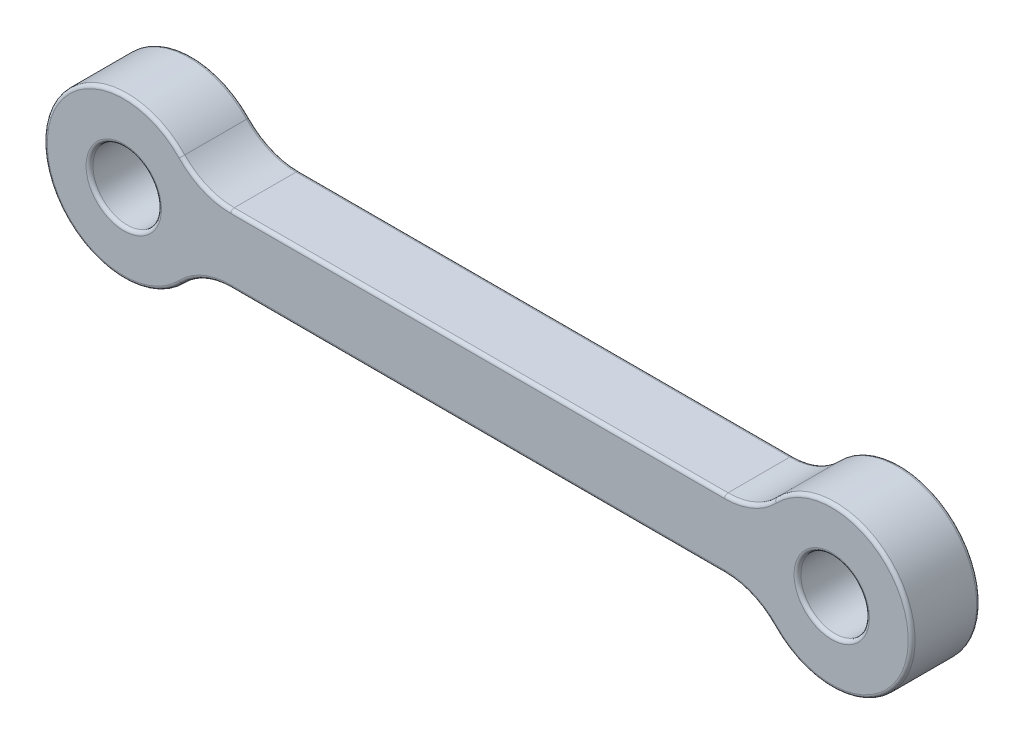
ISO-10303-21;
HEADER;
FILE_DESCRIPTION(('STEP AP214'),'2;1');
FILE_NAME('part.step','',(''),(''),'','','');
FILE_SCHEMA(('AUTOMOTIVE_DESIGN { 1 0 10303 214 1 1 1 1 }'));
ENDSEC;
DATA;
#1=APPLICATION_CONTEXT('core data for automotive mechanical design processes');
#2=APPLICATION_PROTOCOL_DEFINITION('international standard','automotive_design',2000,#1);
#3=PRODUCT_CONTEXT('',#1,'mechanical');
#4=PRODUCT('Part','Part','',(#3));
#5=PRODUCT_RELATED_PRODUCT_CATEGORY('part','',(#4));
#6=PRODUCT_DEFINITION_FORMATION('','',#4);
#7=PRODUCT_DEFINITION_CONTEXT('part definition',#1,'design');
#8=PRODUCT_DEFINITION('design','',#6,#7);
#9=PRODUCT_DEFINITION_SHAPE('','',#8);
#10=(LENGTH_UNIT() NAMED_UNIT(*) SI_UNIT(.MILLI.,.METRE.));
#11=(NAMED_UNIT(*) PLANE_ANGLE_UNIT() SI_UNIT($,.RADIAN.));
#12=(NAMED_UNIT(*) SI_UNIT($,.STERADIAN.) SOLID_ANGLE_UNIT());
#13=UNCERTAINTY_MEASURE_WITH_UNIT(LENGTH_MEASURE(1.E-05),#10,'distance_accuracy_value','');
#14=(GEOMETRIC_REPRESENTATION_CONTEXT(3) GLOBAL_UNCERTAINTY_ASSIGNED_CONTEXT((#13)) GLOBAL_UNIT_ASSIGNED_CONTEXT((#10,
#11,#12)) REPRESENTATION_CONTEXT('',''));
#15=CARTESIAN_POINT('',(0.,0.,0.));
#16=DIRECTION('',(0.,0.,1.));
#17=DIRECTION('',(1.,0.,0.));
#18=AXIS2_PLACEMENT_3D('',#15,#16,#17);
#19=CARTESIAN_POINT('',(0.,0.,3.));
#20=DIRECTION('',(0.,0.,-1.));
#21=DIRECTION('',(-1.,0.,0.));
#22=AXIS2_PLACEMENT_3D('',#19,#20,#21);
#23=CYLINDRICAL_SURFACE('',#22,3.5);
#24=DIRECTION('',(0.,0.,-1.));
#25=VECTOR('',#24,1.);
#26=CARTESIAN_POINT('',(2.52560848605877,2.42307692307692,3.));
#27=LINE('',#26,#25);
#28=CARTESIAN_POINT('',(2.52560848605877,2.42307692307692,2.85));
#29=VERTEX_POINT('',#28);
#30=CARTESIAN_POINT('',(2.52560848605877,2.42307692307692,0.15));
#31=VERTEX_POINT('',#30);
#32=EDGE_CURVE('E299',#29,#31,#27,.T.);
#33=ORIENTED_EDGE('',*,*,#32,.T.);
#34=CARTESIAN_POINT('',(0.,0.,0.15));
#35=DIRECTION('',(0.,0.,1.));
#36=DIRECTION('',(1.,0.,0.));
#37=AXIS2_PLACEMENT_3D('',#34,#35,#36);
#38=CIRCLE('',#37,3.5);
#39=CARTESIAN_POINT('',(2.52560848605877,-2.42307692307692,0.15));
#40=VERTEX_POINT('',#39);
#41=EDGE_CURVE('E214',#31,#40,#38,.T.);
#42=ORIENTED_EDGE('',*,*,#41,.T.);
#43=DIRECTION('',(0.,0.,-1.));
#44=VECTOR('',#43,1.);
#45=CARTESIAN_POINT('',(2.52560848605877,-2.42307692307692,3.));
#46=LINE('',#45,#44);
#47=CARTESIAN_POINT('',(2.52560848605877,-2.42307692307692,2.85));
#48=VERTEX_POINT('',#47);
#49=EDGE_CURVE('E293',#40,#48,#46,.F.);
#50=ORIENTED_EDGE('',*,*,#49,.T.);
#51=CARTESIAN_POINT('',(0.,0.,2.85));
#52=DIRECTION('',(0.,0.,1.));
#53=DIRECTION('',(1.,0.,0.));
#54=AXIS2_PLACEMENT_3D('',#51,#52,#53);
#55=CIRCLE('',#54,3.5);
#56=EDGE_CURVE('E212',#48,#29,#55,.F.);
#57=ORIENTED_EDGE('',*,*,#56,.T.);
#58=EDGE_LOOP('',(#33,#42,#50,#57));
#59=FACE_BOUND('',#58,.T.);
#60=ADVANCED_FACE('F34',(#59),#23,.T.);
#61=CARTESIAN_POINT('',(0.,-1.5,3.));
#62=DIRECTION('',(0.,-1.,0.));
#63=DIRECTION('',(0.,0.,-1.));
#64=AXIS2_PLACEMENT_3D('',#61,#62,#63);
#65=PLANE('',#64);
#66=DIRECTION('',(0.,0.,-1.));
#67=VECTOR('',#66,1.);
#68=CARTESIAN_POINT('',(4.69041575982343,-1.5,3.));
#69=LINE('',#68,#67);
#70=CARTESIAN_POINT('',(4.69041575982343,-1.5,2.85));
#71=VERTEX_POINT('',#70);
#72=CARTESIAN_POINT('',(4.69041575982343,-1.5,0.15));
#73=VERTEX_POINT('',#72);
#74=EDGE_CURVE('E295',#71,#73,#69,.T.);
#75=ORIENTED_EDGE('',*,*,#74,.T.);
#76=DIRECTION('',(-1.,0.,0.));
#77=VECTOR('',#76,1.);
#78=CARTESIAN_POINT('',(26.3095842401766,-1.5,0.15));
#79=LINE('',#78,#77);
#80=CARTESIAN_POINT('',(26.3095842401766,-1.5,0.15));
#81=VERTEX_POINT('',#80);
#82=EDGE_CURVE('E189',#73,#81,#79,.F.);
#83=ORIENTED_EDGE('',*,*,#82,.T.);
#84=DIRECTION('',(0.,0.,1.));
#85=VECTOR('',#84,1.);
#86=CARTESIAN_POINT('',(26.3095842401766,-1.5,3.));
#87=LINE('',#86,#85);
#88=CARTESIAN_POINT('',(26.3095842401766,-1.5,2.85));
#89=VERTEX_POINT('',#88);
#90=EDGE_CURVE('E309',#81,#89,#87,.T.);
#91=ORIENTED_EDGE('',*,*,#90,.T.);
#92=DIRECTION('',(-1.,0.,0.));
#93=VECTOR('',#92,1.);
#94=CARTESIAN_POINT('',(0.,-1.5,2.85));
#95=LINE('',#94,#93);
#96=EDGE_CURVE('E187',#89,#71,#95,.T.);
#97=ORIENTED_EDGE('',*,*,#96,.T.);
#98=EDGE_LOOP('',(#75,#83,#91,#97));
#99=FACE_BOUND('',#98,.T.);
#100=ADVANCED_FACE('F338',(#99),#65,.T.);
#101=CARTESIAN_POINT('',(31.,0.,3.));
#102=DIRECTION('',(0.,0.,-1.));
#103=DIRECTION('',(-1.,0.,0.));
#104=AXIS2_PLACEMENT_3D('',#101,#102,#103);
#105=CYLINDRICAL_SURFACE('',#104,3.5);
#106=DIRECTION('',(0.,0.,-1.));
#107=VECTOR('',#106,1.);
#108=CARTESIAN_POINT('',(28.4743915139412,-2.42307692307692,3.));
#109=LINE('',#108,#107);
#110=CARTESIAN_POINT('',(28.4743915139412,-2.42307692307692,2.85));
#111=VERTEX_POINT('',#110);
#112=CARTESIAN_POINT('',(28.4743915139412,-2.42307692307692,0.15));
#113=VERTEX_POINT('',#112);
#114=EDGE_CURVE('E304',#111,#113,#109,.T.);
#115=ORIENTED_EDGE('',*,*,#114,.T.);
#116=CARTESIAN_POINT('',(31.,0.,0.15));
#117=DIRECTION('',(0.,0.,1.));
#118=DIRECTION('',(1.,0.,0.));
#119=AXIS2_PLACEMENT_3D('',#116,#117,#118);
#120=CIRCLE('',#119,3.5);
#121=CARTESIAN_POINT('',(28.4743915139412,2.42307692307692,0.15));
#122=VERTEX_POINT('',#121);
#123=EDGE_CURVE('E197',#113,#122,#120,.T.);
#124=ORIENTED_EDGE('',*,*,#123,.T.);
#125=DIRECTION('',(0.,0.,-1.));
#126=VECTOR('',#125,1.);
#127=CARTESIAN_POINT('',(28.4743915139412,2.42307692307692,3.));
#128=LINE('',#127,#126);
#129=CARTESIAN_POINT('',(28.4743915139412,2.42307692307692,2.85));
#130=VERTEX_POINT('',#129);
#131=EDGE_CURVE('E300',#122,#130,#128,.F.);
#132=ORIENTED_EDGE('',*,*,#131,.T.);
#133=CARTESIAN_POINT('',(31.,0.,2.85));
#134=DIRECTION('',(0.,0.,1.));
#135=DIRECTION('',(1.,0.,0.));
#136=AXIS2_PLACEMENT_3D('',#133,#134,#135);
#137=CIRCLE('',#136,3.5);
#138=EDGE_CURVE('E195',#130,#111,#137,.F.);
#139=ORIENTED_EDGE('',*,*,#138,.T.);
#140=EDGE_LOOP('',(#115,#124,#132,#139));
#141=FACE_BOUND('',#140,.T.);
#142=ADVANCED_FACE('F382',(#141),#105,.T.);
#143=CARTESIAN_POINT('',(0.,1.5,3.));
#144=DIRECTION('',(0.,-1.,0.));
#145=DIRECTION('',(0.,0.,-1.));
#146=AXIS2_PLACEMENT_3D('',#143,#144,#145);
#147=PLANE('',#146);
#148=DIRECTION('',(0.,0.,-1.));
#149=VECTOR('',#148,1.);
#150=CARTESIAN_POINT('',(26.3095842401766,1.5,3.));
#151=LINE('',#150,#149);
#152=CARTESIAN_POINT('',(26.3095842401766,1.5,2.85));
#153=VERTEX_POINT('',#152);
#154=CARTESIAN_POINT('',(26.3095842401766,1.5,0.15));
#155=VERTEX_POINT('',#154);
#156=EDGE_CURVE('E371',#153,#155,#151,.T.);
#157=ORIENTED_EDGE('',*,*,#156,.T.);
#158=DIRECTION('',(-1.,0.,0.));
#159=VECTOR('',#158,1.);
#160=CARTESIAN_POINT('',(0.,1.5,0.15));
#161=LINE('',#160,#159);
#162=CARTESIAN_POINT('',(4.69041575982343,1.5,0.15));
#163=VERTEX_POINT('',#162);
#164=EDGE_CURVE('E206',#155,#163,#161,.T.);
#165=ORIENTED_EDGE('',*,*,#164,.T.);
#166=DIRECTION('',(0.,0.,1.));
#167=VECTOR('',#166,1.);
#168=CARTESIAN_POINT('',(4.69041575982343,1.5,3.));
#169=LINE('',#168,#167);
#170=CARTESIAN_POINT('',(4.69041575982343,1.5,2.85));
#171=VERTEX_POINT('',#170);
#172=EDGE_CURVE('E255',#163,#171,#169,.T.);
#173=ORIENTED_EDGE('',*,*,#172,.T.);
#174=DIRECTION('',(-1.,0.,0.));
#175=VECTOR('',#174,1.);
#176=CARTESIAN_POINT('',(26.3095842401766,1.5,2.85));
#177=LINE('',#176,#175);
#178=EDGE_CURVE('E204',#171,#153,#177,.F.);
#179=ORIENTED_EDGE('',*,*,#178,.T.);
#180=EDGE_LOOP('',(#157,#165,#173,#179));
#181=FACE_BOUND('',#180,.T.);
#182=ADVANCED_FACE('F370',(#181),#147,.F.);
#183=CARTESIAN_POINT('',(0.,0.,3.));
#184=DIRECTION('',(0.,0.,-1.));
#185=DIRECTION('',(-1.,0.,0.));
#186=AXIS2_PLACEMENT_3D('',#183,#184,#185);
#187=CYLINDRICAL_SURFACE('',#186,1.5);
#188=CARTESIAN_POINT('',(0.,0.,0.15));
#189=DIRECTION('',(0.,0.,1.));
#190=DIRECTION('',(1.,0.,0.));
#191=AXIS2_PLACEMENT_3D('',#188,#189,#190);
#192=CIRCLE('',#191,1.5);
#193=CARTESIAN_POINT('',(1.5,0.,0.15));
#194=VERTEX_POINT('',#193);
#195=EDGE_CURVE('E219',#194,#194,#192,.F.);
#196=ORIENTED_EDGE('',*,*,#195,.T.);
#197=EDGE_LOOP('',(#196));
#198=FACE_BOUND('',#197,.T.);
#199=CARTESIAN_POINT('',(0.,0.,2.85));
#200=DIRECTION('',(0.,0.,1.));
#201=DIRECTION('',(1.,0.,0.));
#202=AXIS2_PLACEMENT_3D('',#199,#200,#201);
#203=CIRCLE('',#202,1.5);
#204=CARTESIAN_POINT('',(1.5,0.,2.85));
#205=VERTEX_POINT('',#204);
#206=EDGE_CURVE('E216',#205,#205,#203,.T.);
#207=ORIENTED_EDGE('',*,*,#206,.T.);
#208=EDGE_LOOP('',(#207));
#209=FACE_BOUND('',#208,.T.);
#210=ADVANCED_FACE('F414',(#198,#209),#187,.F.);
#211=CARTESIAN_POINT('',(31.,0.,3.));
#212=DIRECTION('',(0.,0.,-1.));
#213=DIRECTION('',(-1.,0.,0.));
#214=AXIS2_PLACEMENT_3D('',#211,#212,#213);
#215=CYLINDRICAL_SURFACE('',#214,1.5);
#216=CARTESIAN_POINT('',(31.,0.,0.15));
#217=DIRECTION('',(0.,0.,1.));
#218=DIRECTION('',(1.,0.,0.));
#219=AXIS2_PLACEMENT_3D('',#216,#217,#218);
#220=CIRCLE('',#219,1.5);
#221=CARTESIAN_POINT('',(32.5,0.,0.15));
#222=VERTEX_POINT('',#221);
#223=EDGE_CURVE('E315',#222,#222,#220,.F.);
#224=ORIENTED_EDGE('',*,*,#223,.T.);
#225=EDGE_LOOP('',(#224));
#226=FACE_BOUND('',#225,.T.);
#227=CARTESIAN_POINT('',(31.,0.,2.85));
#228=DIRECTION('',(0.,0.,1.));
#229=DIRECTION('',(1.,0.,0.));
#230=AXIS2_PLACEMENT_3D('',#227,#228,#229);
#231=CIRCLE('',#230,1.5);
#232=CARTESIAN_POINT('',(32.5,0.,2.85));
#233=VERTEX_POINT('',#232);
#234=EDGE_CURVE('E312',#233,#233,#231,.T.);
#235=ORIENTED_EDGE('',*,*,#234,.T.);
#236=EDGE_LOOP('',(#235));
#237=FACE_BOUND('',#236,.T.);
#238=ADVANCED_FACE('F417',(#226,#237),#215,.F.);
#239=CARTESIAN_POINT('',(0.,0.,3.));
#240=DIRECTION('',(0.,0.,1.));
#241=DIRECTION('',(1.,0.,0.));
#242=AXIS2_PLACEMENT_3D('',#239,#240,#241);
#243=PLANE('',#242);
#244=CARTESIAN_POINT('',(31.,0.,3.));
#245=DIRECTION('',(0.,0.,1.));
#246=DIRECTION('',(1.,0.,0.));
#247=AXIS2_PLACEMENT_3D('',#244,#245,#246);
#248=CIRCLE('',#247,1.65);
#249=CARTESIAN_POINT('',(32.65,0.,3.));
#250=VERTEX_POINT('',#249);
#251=EDGE_CURVE('E11',#250,#250,#248,.F.);
#252=ORIENTED_EDGE('',*,*,#251,.T.);
#253=EDGE_LOOP('',(#252));
#254=FACE_BOUND('',#253,.T.);
#255=CARTESIAN_POINT('',(31.,0.,3.));
#256=DIRECTION('',(0.,0.,1.));
#257=DIRECTION('',(1.,0.,0.));
#258=AXIS2_PLACEMENT_3D('',#255,#256,#257);
#259=CIRCLE('',#258,3.35);
#260=CARTESIAN_POINT('',(28.5826318776295,-2.31923076923077,3.));
#261=VERTEX_POINT('',#260);
#262=CARTESIAN_POINT('',(28.5826318776295,2.31923076923077,3.));
#263=VERTEX_POINT('',#262);
#264=EDGE_CURVE('E51',#261,#263,#259,.T.);
#265=ORIENTED_EDGE('',*,*,#264,.T.);
#266=CARTESIAN_POINT('',(26.3095842401766,4.5,3.));
#267=DIRECTION('',(0.,0.,1.));
#268=DIRECTION('',(1.,0.,0.));
#269=AXIS2_PLACEMENT_3D('',#266,#267,#268);
#270=CIRCLE('',#269,3.15);
#271=CARTESIAN_POINT('',(26.3095842401766,1.35,3.));
#272=VERTEX_POINT('',#271);
#273=EDGE_CURVE('E43',#263,#272,#270,.F.);
#274=ORIENTED_EDGE('',*,*,#273,.T.);
#275=DIRECTION('',(-1.,0.,0.));
#276=VECTOR('',#275,1.);
#277=CARTESIAN_POINT('',(4.69041575982343,1.35,3.));
#278=LINE('',#277,#276);
#279=CARTESIAN_POINT('',(4.69041575982343,1.35,3.));
#280=VERTEX_POINT('',#279);
#281=EDGE_CURVE('E225',#272,#280,#278,.T.);
#282=ORIENTED_EDGE('',*,*,#281,.T.);
#283=CARTESIAN_POINT('',(4.69041575982343,4.5,3.));
#284=DIRECTION('',(0.,0.,1.));
#285=DIRECTION('',(1.,0.,0.));
#286=AXIS2_PLACEMENT_3D('',#283,#284,#285);
#287=CIRCLE('',#286,3.15);
#288=CARTESIAN_POINT('',(2.41736812237054,2.31923076923077,3.));
#289=VERTEX_POINT('',#288);
#290=EDGE_CURVE('E227',#280,#289,#287,.F.);
#291=ORIENTED_EDGE('',*,*,#290,.T.);
#292=CARTESIAN_POINT('',(0.,0.,3.));
#293=DIRECTION('',(0.,0.,1.));
#294=DIRECTION('',(1.,0.,0.));
#295=AXIS2_PLACEMENT_3D('',#292,#293,#294);
#296=CIRCLE('',#295,3.35);
#297=CARTESIAN_POINT('',(2.41736812237054,-2.31923076923077,3.));
#298=VERTEX_POINT('',#297);
#299=EDGE_CURVE('E229',#289,#298,#296,.T.);
#300=ORIENTED_EDGE('',*,*,#299,.T.);
#301=CARTESIAN_POINT('',(4.69041575982343,-4.5,3.));
#302=DIRECTION('',(0.,0.,1.));
#303=DIRECTION('',(1.,0.,0.));
#304=AXIS2_PLACEMENT_3D('',#301,#302,#303);
#305=CIRCLE('',#304,3.15);
#306=CARTESIAN_POINT('',(4.69041575982343,-1.35,3.));
#307=VERTEX_POINT('',#306);
#308=EDGE_CURVE('E231',#298,#307,#305,.F.);
#309=ORIENTED_EDGE('',*,*,#308,.T.);
#310=DIRECTION('',(-1.,0.,0.));
#311=VECTOR('',#310,1.);
#312=CARTESIAN_POINT('',(0.,-1.35,3.));
#313=LINE('',#312,#311);
#314=CARTESIAN_POINT('',(26.3095842401766,-1.35,3.));
#315=VERTEX_POINT('',#314);
#316=EDGE_CURVE('E233',#307,#315,#313,.F.);
#317=ORIENTED_EDGE('',*,*,#316,.T.);
#318=CARTESIAN_POINT('',(26.3095842401766,-4.5,3.));
#319=DIRECTION('',(0.,0.,1.));
#320=DIRECTION('',(1.,0.,0.));
#321=AXIS2_PLACEMENT_3D('',#318,#319,#320);
#322=CIRCLE('',#321,3.15);
#323=EDGE_CURVE('E56',#315,#261,#322,.F.);
#324=ORIENTED_EDGE('',*,*,#323,.T.);
#325=EDGE_LOOP('',(#265,#274,#282,#291,#300,#309,#317,#324));
#326=FACE_BOUND('',#325,.T.);
#327=CARTESIAN_POINT('',(0.,0.,3.));
#328=DIRECTION('',(0.,0.,1.));
#329=DIRECTION('',(1.,0.,0.));
#330=AXIS2_PLACEMENT_3D('',#327,#328,#329);
#331=CIRCLE('',#330,1.65);
#332=CARTESIAN_POINT('',(1.65,0.,3.));
#333=VERTEX_POINT('',#332);
#334=EDGE_CURVE('E222',#333,#333,#331,.F.);
#335=ORIENTED_EDGE('',*,*,#334,.T.);
#336=EDGE_LOOP('',(#335));
#337=FACE_BOUND('',#336,.T.);
#338=ADVANCED_FACE('F355',(#254,#326,#337),#243,.T.);
#339=CARTESIAN_POINT('',(0.,0.,0.));
#340=DIRECTION('',(0.,0.,1.));
#341=DIRECTION('',(1.,0.,0.));
#342=AXIS2_PLACEMENT_3D('',#339,#340,#341);
#343=PLANE('',#342);
#344=CARTESIAN_POINT('',(31.,0.,0.));
#345=DIRECTION('',(0.,0.,1.));
#346=DIRECTION('',(1.,0.,0.));
#347=AXIS2_PLACEMENT_3D('',#344,#345,#346);
#348=CIRCLE('',#347,1.65);
#349=CARTESIAN_POINT('',(32.65,0.,0.));
#350=VERTEX_POINT('',#349);
#351=EDGE_CURVE('E176',#350,#350,#348,.T.);
#352=ORIENTED_EDGE('',*,*,#351,.T.);
#353=EDGE_LOOP('',(#352));
#354=FACE_BOUND('',#353,.T.);
#355=DIRECTION('',(-1.,0.,0.));
#356=VECTOR('',#355,1.);
#357=CARTESIAN_POINT('',(4.69041575982343,-1.35,0.));
#358=LINE('',#357,#356);
#359=CARTESIAN_POINT('',(26.3095842401766,-1.35,0.));
#360=VERTEX_POINT('',#359);
#361=CARTESIAN_POINT('',(4.69041575982343,-1.35,0.));
#362=VERTEX_POINT('',#361);
#363=EDGE_CURVE('E174',#360,#362,#358,.T.);
#364=ORIENTED_EDGE('',*,*,#363,.T.);
#365=CARTESIAN_POINT('',(4.69041575982343,-4.5,0.));
#366=DIRECTION('',(0.,0.,1.));
#367=DIRECTION('',(1.,0.,0.));
#368=AXIS2_PLACEMENT_3D('',#365,#366,#367);
#369=CIRCLE('',#368,3.15);
#370=CARTESIAN_POINT('',(2.41736812237054,-2.31923076923077,0.));
#371=VERTEX_POINT('',#370);
#372=EDGE_CURVE('E154',#362,#371,#369,.T.);
#373=ORIENTED_EDGE('',*,*,#372,.T.);
#374=CARTESIAN_POINT('',(0.,0.,0.));
#375=DIRECTION('',(0.,0.,1.));
#376=DIRECTION('',(1.,0.,0.));
#377=AXIS2_PLACEMENT_3D('',#374,#375,#376);
#378=CIRCLE('',#377,3.35);
#379=CARTESIAN_POINT('',(2.41736812237054,2.31923076923077,0.));
#380=VERTEX_POINT('',#379);
#381=EDGE_CURVE('E162',#371,#380,#378,.F.);
#382=ORIENTED_EDGE('',*,*,#381,.T.);
#383=CARTESIAN_POINT('',(4.69041575982343,4.5,0.));
#384=DIRECTION('',(0.,0.,1.));
#385=DIRECTION('',(1.,0.,0.));
#386=AXIS2_PLACEMENT_3D('',#383,#384,#385);
#387=CIRCLE('',#386,3.15);
#388=CARTESIAN_POINT('',(4.69041575982343,1.35,0.));
#389=VERTEX_POINT('',#388);
#390=EDGE_CURVE('E168',#380,#389,#387,.T.);
#391=ORIENTED_EDGE('',*,*,#390,.T.);
#392=DIRECTION('',(-1.,0.,0.));
#393=VECTOR('',#392,1.);
#394=CARTESIAN_POINT('',(0.,1.35,0.));
#395=LINE('',#394,#393);
#396=CARTESIAN_POINT('',(26.3095842401766,1.35,0.));
#397=VERTEX_POINT('',#396);
#398=EDGE_CURVE('E321',#389,#397,#395,.F.);
#399=ORIENTED_EDGE('',*,*,#398,.T.);
#400=CARTESIAN_POINT('',(26.3095842401766,4.5,0.));
#401=DIRECTION('',(0.,0.,1.));
#402=DIRECTION('',(1.,0.,0.));
#403=AXIS2_PLACEMENT_3D('',#400,#401,#402);
#404=CIRCLE('',#403,3.15);
#405=CARTESIAN_POINT('',(28.5826318776295,2.31923076923077,0.));
#406=VERTEX_POINT('',#405);
#407=EDGE_CURVE('E323',#397,#406,#404,.T.);
#408=ORIENTED_EDGE('',*,*,#407,.T.);
#409=CARTESIAN_POINT('',(31.,0.,0.));
#410=DIRECTION('',(0.,0.,1.));
#411=DIRECTION('',(1.,0.,0.));
#412=AXIS2_PLACEMENT_3D('',#409,#410,#411);
#413=CIRCLE('',#412,3.35);
#414=CARTESIAN_POINT('',(28.5826318776295,-2.31923076923077,0.));
#415=VERTEX_POINT('',#414);
#416=EDGE_CURVE('E325',#406,#415,#413,.F.);
#417=ORIENTED_EDGE('',*,*,#416,.T.);
#418=CARTESIAN_POINT('',(26.3095842401766,-4.5,0.));
#419=DIRECTION('',(0.,0.,1.));
#420=DIRECTION('',(1.,0.,0.));
#421=AXIS2_PLACEMENT_3D('',#418,#419,#420);
#422=CIRCLE('',#421,3.15);
#423=EDGE_CURVE('E181',#415,#360,#422,.T.);
#424=ORIENTED_EDGE('',*,*,#423,.T.);
#425=EDGE_LOOP('',(#364,#373,#382,#391,#399,#408,#417,#424));
#426=FACE_BOUND('',#425,.T.);
#427=CARTESIAN_POINT('',(0.,0.,0.));
#428=DIRECTION('',(0.,0.,1.));
#429=DIRECTION('',(1.,0.,0.));
#430=AXIS2_PLACEMENT_3D('',#427,#428,#429);
#431=CIRCLE('',#430,1.65);
#432=CARTESIAN_POINT('',(1.65,0.,0.));
#433=VERTEX_POINT('',#432);
#434=EDGE_CURVE('E169',#433,#433,#431,.T.);
#435=ORIENTED_EDGE('',*,*,#434,.T.);
#436=EDGE_LOOP('',(#435));
#437=FACE_BOUND('',#436,.T.);
#438=ADVANCED_FACE('F171',(#354,#426,#437),#343,.F.);
#439=CARTESIAN_POINT('',(26.3095842401766,4.5,3.));
#440=DIRECTION('',(0.,0.,-1.));
#441=DIRECTION('',(-1.,0.,0.));
#442=AXIS2_PLACEMENT_3D('',#439,#440,#441);
#443=CYLINDRICAL_SURFACE('',#442,3.);
#444=ORIENTED_EDGE('',*,*,#131,.F.);
#445=CARTESIAN_POINT('',(26.3095842401766,4.5,0.15));
#446=DIRECTION('',(0.,0.,1.));
#447=DIRECTION('',(1.,0.,0.));
#448=AXIS2_PLACEMENT_3D('',#445,#446,#447);
#449=CIRCLE('',#448,3.);
#450=EDGE_CURVE('E202',#122,#155,#449,.F.);
#451=ORIENTED_EDGE('',*,*,#450,.T.);
#452=ORIENTED_EDGE('',*,*,#156,.F.);
#453=CARTESIAN_POINT('',(26.3095842401766,4.5,2.85));
#454=DIRECTION('',(0.,0.,1.));
#455=DIRECTION('',(1.,0.,0.));
#456=AXIS2_PLACEMENT_3D('',#453,#454,#455);
#457=CIRCLE('',#456,3.);
#458=EDGE_CURVE('E199',#153,#130,#457,.T.);
#459=ORIENTED_EDGE('',*,*,#458,.T.);
#460=EDGE_LOOP('',(#444,#451,#452,#459));
#461=FACE_BOUND('',#460,.T.);
#462=ADVANCED_FACE('F376',(#461),#443,.F.);
#463=CARTESIAN_POINT('',(4.69041575982343,4.5,3.));
#464=DIRECTION('',(0.,0.,-1.));
#465=DIRECTION('',(-1.,0.,0.));
#466=AXIS2_PLACEMENT_3D('',#463,#464,#465);
#467=CYLINDRICAL_SURFACE('',#466,3.);
#468=ORIENTED_EDGE('',*,*,#172,.F.);
#469=CARTESIAN_POINT('',(4.69041575982343,4.5,0.15));
#470=DIRECTION('',(0.,0.,1.));
#471=DIRECTION('',(1.,0.,0.));
#472=AXIS2_PLACEMENT_3D('',#469,#470,#471);
#473=CIRCLE('',#472,3.);
#474=EDGE_CURVE('E210',#163,#31,#473,.F.);
#475=ORIENTED_EDGE('',*,*,#474,.T.);
#476=ORIENTED_EDGE('',*,*,#32,.F.);
#477=CARTESIAN_POINT('',(4.69041575982343,4.5,2.85));
#478=DIRECTION('',(0.,0.,1.));
#479=DIRECTION('',(1.,0.,0.));
#480=AXIS2_PLACEMENT_3D('',#477,#478,#479);
#481=CIRCLE('',#480,3.);
#482=EDGE_CURVE('E208',#29,#171,#481,.T.);
#483=ORIENTED_EDGE('',*,*,#482,.T.);
#484=EDGE_LOOP('',(#468,#475,#476,#483));
#485=FACE_BOUND('',#484,.T.);
#486=ADVANCED_FACE('F396',(#485),#467,.F.);
#487=CARTESIAN_POINT('',(26.3095842401766,-4.5,3.));
#488=DIRECTION('',(0.,0.,-1.));
#489=DIRECTION('',(-1.,0.,0.));
#490=AXIS2_PLACEMENT_3D('',#487,#488,#489);
#491=CYLINDRICAL_SURFACE('',#490,3.);
#492=ORIENTED_EDGE('',*,*,#90,.F.);
#493=CARTESIAN_POINT('',(26.3095842401766,-4.5,0.15));
#494=DIRECTION('',(0.,0.,1.));
#495=DIRECTION('',(1.,0.,0.));
#496=AXIS2_PLACEMENT_3D('',#493,#494,#495);
#497=CIRCLE('',#496,3.);
#498=EDGE_CURVE('E193',#81,#113,#497,.F.);
#499=ORIENTED_EDGE('',*,*,#498,.T.);
#500=ORIENTED_EDGE('',*,*,#114,.F.);
#501=CARTESIAN_POINT('',(26.3095842401766,-4.5,2.85));
#502=DIRECTION('',(0.,0.,1.));
#503=DIRECTION('',(1.,0.,0.));
#504=AXIS2_PLACEMENT_3D('',#501,#502,#503);
#505=CIRCLE('',#504,3.);
#506=EDGE_CURVE('E191',#111,#89,#505,.T.);
#507=ORIENTED_EDGE('',*,*,#506,.T.);
#508=EDGE_LOOP('',(#492,#499,#500,#507));
#509=FACE_BOUND('',#508,.T.);
#510=ADVANCED_FACE('F340',(#509),#491,.F.);
#511=CARTESIAN_POINT('',(4.69041575982343,-4.5,3.));
#512=DIRECTION('',(0.,0.,-1.));
#513=DIRECTION('',(-1.,0.,0.));
#514=AXIS2_PLACEMENT_3D('',#511,#512,#513);
#515=CYLINDRICAL_SURFACE('',#514,3.);
#516=ORIENTED_EDGE('',*,*,#49,.F.);
#517=CARTESIAN_POINT('',(4.69041575982343,-4.5,0.15));
#518=DIRECTION('',(0.,0.,1.));
#519=DIRECTION('',(1.,0.,0.));
#520=AXIS2_PLACEMENT_3D('',#517,#518,#519);
#521=CIRCLE('',#520,3.);
#522=EDGE_CURVE('E156',#40,#73,#521,.F.);
#523=ORIENTED_EDGE('',*,*,#522,.T.);
#524=ORIENTED_EDGE('',*,*,#74,.F.);
#525=CARTESIAN_POINT('',(4.69041575982343,-4.5,2.85));
#526=DIRECTION('',(0.,0.,1.));
#527=DIRECTION('',(1.,0.,0.));
#528=AXIS2_PLACEMENT_3D('',#525,#526,#527);
#529=CIRCLE('',#528,3.);
#530=EDGE_CURVE('E179',#71,#48,#529,.T.);
#531=ORIENTED_EDGE('',*,*,#530,.T.);
#532=EDGE_LOOP('',(#516,#523,#524,#531));
#533=FACE_BOUND('',#532,.T.);
#534=ADVANCED_FACE('F292',(#533),#515,.F.);
#535=CARTESIAN_POINT('',(31.,0.,0.15));
#536=DIRECTION('',(0.,0.,1.));
#537=DIRECTION('',(1.,0.,0.));
#538=AXIS2_PLACEMENT_3D('',#535,#536,#537);
#539=TOROIDAL_SURFACE('',#538,1.65,0.15);
#540=ORIENTED_EDGE('',*,*,#351,.F.);
#541=EDGE_LOOP('',(#540));
#542=FACE_BOUND('',#541,.T.);
#543=ORIENTED_EDGE('',*,*,#223,.F.);
#544=EDGE_LOOP('',(#543));
#545=FACE_BOUND('',#544,.T.);
#546=ADVANCED_FACE('F427',(#542,#545),#539,.T.);
#547=CARTESIAN_POINT('',(26.3095842401766,4.5,0.15));
#548=DIRECTION('',(0.,0.,1.));
#549=DIRECTION('',(1.,0.,0.));
#550=AXIS2_PLACEMENT_3D('',#547,#548,#549);
#551=TOROIDAL_SURFACE('',#550,3.15,0.15);
#552=CARTESIAN_POINT('',(26.3095842401766,1.35,0.15));
#553=DIRECTION('',(-1.,0.,0.));
#554=DIRECTION('',(0.,0.,1.));
#555=AXIS2_PLACEMENT_3D('',#552,#553,#554);
#556=CIRCLE('',#555,0.15);
#557=EDGE_CURVE('E249',#155,#397,#556,.T.);
#558=ORIENTED_EDGE('',*,*,#557,.F.);
#559=ORIENTED_EDGE('',*,*,#450,.F.);
#560=CARTESIAN_POINT('',(28.5826318776295,2.31923076923077,0.15));
#561=DIRECTION('',(0.6923076923077,0.721602424588213,0.));
#562=DIRECTION('',(-0.721602424588213,0.6923076923077,0.));
#563=AXIS2_PLACEMENT_3D('',#560,#561,#562);
#564=CIRCLE('',#563,0.15);
#565=EDGE_CURVE('E252',#406,#122,#564,.T.);
#566=ORIENTED_EDGE('',*,*,#565,.F.);
#567=ORIENTED_EDGE('',*,*,#407,.F.);
#568=EDGE_LOOP('',(#558,#559,#566,#567));
#569=FACE_BOUND('',#568,.T.);
#570=ADVANCED_FACE('F388',(#569),#551,.T.);
#571=CARTESIAN_POINT('',(31.,0.,0.15));
#572=DIRECTION('',(0.,0.,1.));
#573=DIRECTION('',(1.,0.,0.));
#574=AXIS2_PLACEMENT_3D('',#571,#572,#573);
#575=TOROIDAL_SURFACE('',#574,3.35,0.15);
#576=ORIENTED_EDGE('',*,*,#565,.T.);
#577=ORIENTED_EDGE('',*,*,#123,.F.);
#578=CARTESIAN_POINT('',(28.5826318776295,-2.31923076923077,0.15));
#579=DIRECTION('',(-0.692307692307698,0.721602424588214,0.));
#580=DIRECTION('',(-0.721602424588214,-0.692307692307698,0.));
#581=AXIS2_PLACEMENT_3D('',#578,#579,#580);
#582=CIRCLE('',#581,0.15);
#583=EDGE_CURVE('E246',#415,#113,#582,.T.);
#584=ORIENTED_EDGE('',*,*,#583,.F.);
#585=ORIENTED_EDGE('',*,*,#416,.F.);
#586=EDGE_LOOP('',(#576,#577,#584,#585));
#587=FACE_BOUND('',#586,.T.);
#588=ADVANCED_FACE('F384',(#587),#575,.T.);
#589=CARTESIAN_POINT('',(0.,1.35,0.15));
#590=DIRECTION('',(-1.,0.,0.));
#591=DIRECTION('',(0.,0.,1.));
#592=AXIS2_PLACEMENT_3D('',#589,#590,#591);
#593=CYLINDRICAL_SURFACE('',#592,0.15);
#594=ORIENTED_EDGE('',*,*,#557,.T.);
#595=ORIENTED_EDGE('',*,*,#398,.F.);
#596=CARTESIAN_POINT('',(4.69041575982343,1.35,0.15));
#597=DIRECTION('',(-1.,0.,0.));
#598=DIRECTION('',(0.,0.,1.));
#599=AXIS2_PLACEMENT_3D('',#596,#597,#598);
#600=CIRCLE('',#599,0.15);
#601=EDGE_CURVE('E243',#163,#389,#600,.T.);
#602=ORIENTED_EDGE('',*,*,#601,.F.);
#603=ORIENTED_EDGE('',*,*,#164,.F.);
#604=EDGE_LOOP('',(#594,#595,#602,#603));
#605=FACE_BOUND('',#604,.T.);
#606=ADVANCED_FACE('F393',(#605),#593,.T.);
#607=CARTESIAN_POINT('',(26.3095842401766,-4.5,0.15));
#608=DIRECTION('',(0.,0.,1.));
#609=DIRECTION('',(1.,0.,0.));
#610=AXIS2_PLACEMENT_3D('',#607,#608,#609);
#611=TOROIDAL_SURFACE('',#610,3.15,0.15);
#612=ORIENTED_EDGE('',*,*,#583,.T.);
#613=ORIENTED_EDGE('',*,*,#498,.F.);
#614=CARTESIAN_POINT('',(26.3095842401766,-1.35,0.15));
#615=DIRECTION('',(-1.,0.,0.));
#616=DIRECTION('',(0.,0.,1.));
#617=AXIS2_PLACEMENT_3D('',#614,#615,#616);
#618=CIRCLE('',#617,0.15);
#619=EDGE_CURVE('E240',#360,#81,#618,.T.);
#620=ORIENTED_EDGE('',*,*,#619,.F.);
#621=ORIENTED_EDGE('',*,*,#423,.F.);
#622=EDGE_LOOP('',(#612,#613,#620,#621));
#623=FACE_BOUND('',#622,.T.);
#624=ADVANCED_FACE('F332',(#623),#611,.T.);
#625=CARTESIAN_POINT('',(4.69041575982343,4.5,0.15));
#626=DIRECTION('',(0.,0.,1.));
#627=DIRECTION('',(1.,0.,0.));
#628=AXIS2_PLACEMENT_3D('',#625,#626,#627);
#629=TOROIDAL_SURFACE('',#628,3.15,0.15);
#630=ORIENTED_EDGE('',*,*,#601,.T.);
#631=ORIENTED_EDGE('',*,*,#390,.F.);
#632=CARTESIAN_POINT('',(2.41736812237054,2.31923076923077,0.15));
#633=DIRECTION('',(-0.692307692307693,0.72160242458822,0.));
#634=DIRECTION('',(-0.72160242458822,-0.692307692307693,0.));
#635=AXIS2_PLACEMENT_3D('',#632,#633,#634);
#636=CIRCLE('',#635,0.15);
#637=EDGE_CURVE('E165',#31,#380,#636,.T.);
#638=ORIENTED_EDGE('',*,*,#637,.F.);
#639=ORIENTED_EDGE('',*,*,#474,.F.);
#640=EDGE_LOOP('',(#630,#631,#638,#639));
#641=FACE_BOUND('',#640,.T.);
#642=ADVANCED_FACE('F438',(#641),#629,.T.);
#643=CARTESIAN_POINT('',(0.,-1.35,0.15));
#644=DIRECTION('',(1.,0.,0.));
#645=DIRECTION('',(0.,0.,-1.));
#646=AXIS2_PLACEMENT_3D('',#643,#644,#645);
#647=CYLINDRICAL_SURFACE('',#646,0.15);
#648=ORIENTED_EDGE('',*,*,#619,.T.);
#649=ORIENTED_EDGE('',*,*,#82,.F.);
#650=CARTESIAN_POINT('',(4.69041575982343,-1.35,0.15));
#651=DIRECTION('',(-1.,0.,0.));
#652=DIRECTION('',(0.,0.,1.));
#653=AXIS2_PLACEMENT_3D('',#650,#651,#652);
#654=CIRCLE('',#653,0.15);
#655=EDGE_CURVE('E159',#362,#73,#654,.T.);
#656=ORIENTED_EDGE('',*,*,#655,.F.);
#657=ORIENTED_EDGE('',*,*,#363,.F.);
#658=EDGE_LOOP('',(#648,#649,#656,#657));
#659=FACE_BOUND('',#658,.T.);
#660=ADVANCED_FACE('F335',(#659),#647,.T.);
#661=CARTESIAN_POINT('',(0.,0.,0.15));
#662=DIRECTION('',(0.,0.,1.));
#663=DIRECTION('',(1.,0.,0.));
#664=AXIS2_PLACEMENT_3D('',#661,#662,#663);
#665=TOROIDAL_SURFACE('',#664,3.35,0.15);
#666=ORIENTED_EDGE('',*,*,#637,.T.);
#667=ORIENTED_EDGE('',*,*,#381,.F.);
#668=CARTESIAN_POINT('',(2.41736812237054,-2.31923076923077,0.15));
#669=DIRECTION('',(0.692307692307693,0.72160242458822,0.));
#670=DIRECTION('',(-0.72160242458822,0.692307692307693,0.));
#671=AXIS2_PLACEMENT_3D('',#668,#669,#670);
#672=CIRCLE('',#671,0.15);
#673=EDGE_CURVE('E150',#40,#371,#672,.T.);
#674=ORIENTED_EDGE('',*,*,#673,.F.);
#675=ORIENTED_EDGE('',*,*,#41,.F.);
#676=EDGE_LOOP('',(#666,#667,#674,#675));
#677=FACE_BOUND('',#676,.T.);
#678=ADVANCED_FACE('F163',(#677),#665,.T.);
#679=CARTESIAN_POINT('',(4.69041575982343,-4.5,0.15));
#680=DIRECTION('',(0.,0.,1.));
#681=DIRECTION('',(1.,0.,0.));
#682=AXIS2_PLACEMENT_3D('',#679,#680,#681);
#683=TOROIDAL_SURFACE('',#682,3.15,0.15);
#684=ORIENTED_EDGE('',*,*,#655,.T.);
#685=ORIENTED_EDGE('',*,*,#522,.F.);
#686=ORIENTED_EDGE('',*,*,#673,.T.);
#687=ORIENTED_EDGE('',*,*,#372,.F.);
#688=EDGE_LOOP('',(#684,#685,#686,#687));
#689=FACE_BOUND('',#688,.T.);
#690=ADVANCED_FACE('F152',(#689),#683,.T.);
#691=CARTESIAN_POINT('',(0.,0.,0.15));
#692=DIRECTION('',(0.,0.,1.));
#693=DIRECTION('',(1.,0.,0.));
#694=AXIS2_PLACEMENT_3D('',#691,#692,#693);
#695=TOROIDAL_SURFACE('',#694,1.65,0.15);
#696=ORIENTED_EDGE('',*,*,#195,.F.);
#697=EDGE_LOOP('',(#696));
#698=FACE_BOUND('',#697,.T.);
#699=ORIENTED_EDGE('',*,*,#434,.F.);
#700=EDGE_LOOP('',(#699));
#701=FACE_BOUND('',#700,.T.);
#702=ADVANCED_FACE('F433',(#698,#701),#695,.T.);
#703=CARTESIAN_POINT('',(31.,0.,2.85));
#704=DIRECTION('',(0.,0.,1.));
#705=DIRECTION('',(1.,0.,0.));
#706=AXIS2_PLACEMENT_3D('',#703,#704,#705);
#707=TOROIDAL_SURFACE('',#706,1.65,0.15);
#708=ORIENTED_EDGE('',*,*,#234,.F.);
#709=EDGE_LOOP('',(#708));
#710=FACE_BOUND('',#709,.T.);
#711=ORIENTED_EDGE('',*,*,#251,.F.);
#712=EDGE_LOOP('',(#711));
#713=FACE_BOUND('',#712,.T.);
#714=ADVANCED_FACE('F452',(#710,#713),#707,.T.);
#715=CARTESIAN_POINT('',(4.69041575982343,-4.5,2.85));
#716=DIRECTION('',(0.,0.,1.));
#717=DIRECTION('',(1.,0.,0.));
#718=AXIS2_PLACEMENT_3D('',#715,#716,#717);
#719=TOROIDAL_SURFACE('',#718,3.15,0.15);
#720=CARTESIAN_POINT('',(2.41736812237054,-2.31923076923077,2.85));
#721=DIRECTION('',(-0.692307692307693,-0.72160242458822,0.));
#722=DIRECTION('',(0.72160242458822,-0.692307692307693,0.));
#723=AXIS2_PLACEMENT_3D('',#720,#721,#722);
#724=CIRCLE('',#723,0.15);
#725=EDGE_CURVE('E271',#48,#298,#724,.T.);
#726=ORIENTED_EDGE('',*,*,#725,.F.);
#727=ORIENTED_EDGE('',*,*,#530,.F.);
#728=CARTESIAN_POINT('',(4.69041575982343,-1.35,2.85));
#729=DIRECTION('',(1.,0.,0.));
#730=DIRECTION('',(0.,0.,-1.));
#731=AXIS2_PLACEMENT_3D('',#728,#729,#730);
#732=CIRCLE('',#731,0.15);
#733=EDGE_CURVE('E38',#307,#71,#732,.T.);
#734=ORIENTED_EDGE('',*,*,#733,.F.);
#735=ORIENTED_EDGE('',*,*,#308,.F.);
#736=EDGE_LOOP('',(#726,#727,#734,#735));
#737=FACE_BOUND('',#736,.T.);
#738=ADVANCED_FACE('F287',(#737),#719,.T.);
#739=CARTESIAN_POINT('',(0.,-1.35,2.85));
#740=DIRECTION('',(-1.,0.,0.));
#741=DIRECTION('',(0.,0.,1.));
#742=AXIS2_PLACEMENT_3D('',#739,#740,#741);
#743=CYLINDRICAL_SURFACE('',#742,0.15);
#744=ORIENTED_EDGE('',*,*,#733,.T.);
#745=ORIENTED_EDGE('',*,*,#96,.F.);
#746=CARTESIAN_POINT('',(26.3095842401766,-1.35,2.85));
#747=DIRECTION('',(1.,0.,0.));
#748=DIRECTION('',(0.,0.,-1.));
#749=AXIS2_PLACEMENT_3D('',#746,#747,#748);
#750=CIRCLE('',#749,0.15);
#751=EDGE_CURVE('E269',#315,#89,#750,.T.);
#752=ORIENTED_EDGE('',*,*,#751,.F.);
#753=ORIENTED_EDGE('',*,*,#316,.F.);
#754=EDGE_LOOP('',(#744,#745,#752,#753));
#755=FACE_BOUND('',#754,.T.);
#756=ADVANCED_FACE('F282',(#755),#743,.T.);
#757=CARTESIAN_POINT('',(0.,0.,2.85));
#758=DIRECTION('',(0.,0.,1.));
#759=DIRECTION('',(1.,0.,0.));
#760=AXIS2_PLACEMENT_3D('',#757,#758,#759);
#761=TOROIDAL_SURFACE('',#760,3.35,0.15);
#762=ORIENTED_EDGE('',*,*,#725,.T.);
#763=ORIENTED_EDGE('',*,*,#299,.F.);
#764=CARTESIAN_POINT('',(2.41736812237054,2.31923076923077,2.85));
#765=DIRECTION('',(0.692307692307693,-0.72160242458822,0.));
#766=DIRECTION('',(0.72160242458822,0.692307692307693,0.));
#767=AXIS2_PLACEMENT_3D('',#764,#765,#766);
#768=CIRCLE('',#767,0.15);
#769=EDGE_CURVE('E266',#29,#289,#768,.T.);
#770=ORIENTED_EDGE('',*,*,#769,.F.);
#771=ORIENTED_EDGE('',*,*,#56,.F.);
#772=EDGE_LOOP('',(#762,#763,#770,#771));
#773=FACE_BOUND('',#772,.T.);
#774=ADVANCED_FACE('F397',(#773),#761,.T.);
#775=CARTESIAN_POINT('',(26.3095842401766,-4.5,2.85));
#776=DIRECTION('',(0.,0.,1.));
#777=DIRECTION('',(1.,0.,0.));
#778=AXIS2_PLACEMENT_3D('',#775,#776,#777);
#779=TOROIDAL_SURFACE('',#778,3.15,0.15);
#780=ORIENTED_EDGE('',*,*,#751,.T.);
#781=ORIENTED_EDGE('',*,*,#506,.F.);
#782=CARTESIAN_POINT('',(28.5826318776295,-2.31923076923077,2.85));
#783=DIRECTION('',(0.692307692307703,-0.72160242458821,0.));
#784=DIRECTION('',(0.72160242458821,0.692307692307703,0.));
#785=AXIS2_PLACEMENT_3D('',#782,#783,#784);
#786=CIRCLE('',#785,0.15);
#787=EDGE_CURVE('E263',#261,#111,#786,.T.);
#788=ORIENTED_EDGE('',*,*,#787,.F.);
#789=ORIENTED_EDGE('',*,*,#323,.F.);
#790=EDGE_LOOP('',(#780,#781,#788,#789));
#791=FACE_BOUND('',#790,.T.);
#792=ADVANCED_FACE('F345',(#791),#779,.T.);
#793=CARTESIAN_POINT('',(4.69041575982343,4.5,2.85));
#794=DIRECTION('',(0.,0.,1.));
#795=DIRECTION('',(1.,0.,0.));
#796=AXIS2_PLACEMENT_3D('',#793,#794,#795);
#797=TOROIDAL_SURFACE('',#796,3.15,0.15);
#798=ORIENTED_EDGE('',*,*,#769,.T.);
#799=ORIENTED_EDGE('',*,*,#290,.F.);
#800=CARTESIAN_POINT('',(4.69041575982343,1.35,2.85));
#801=DIRECTION('',(1.,0.,0.));
#802=DIRECTION('',(0.,0.,-1.));
#803=AXIS2_PLACEMENT_3D('',#800,#801,#802);
#804=CIRCLE('',#803,0.15);
#805=EDGE_CURVE('E260',#171,#280,#804,.T.);
#806=ORIENTED_EDGE('',*,*,#805,.F.);
#807=ORIENTED_EDGE('',*,*,#482,.F.);
#808=EDGE_LOOP('',(#798,#799,#806,#807));
#809=FACE_BOUND('',#808,.T.);
#810=ADVANCED_FACE('F361',(#809),#797,.T.);
#811=CARTESIAN_POINT('',(31.,0.,2.85));
#812=DIRECTION('',(0.,0.,1.));
#813=DIRECTION('',(1.,0.,0.));
#814=AXIS2_PLACEMENT_3D('',#811,#812,#813);
#815=TOROIDAL_SURFACE('',#814,3.35,0.15);
#816=ORIENTED_EDGE('',*,*,#787,.T.);
#817=ORIENTED_EDGE('',*,*,#138,.F.);
#818=CARTESIAN_POINT('',(28.5826318776295,2.31923076923077,2.85));
#819=DIRECTION('',(-0.692307692307701,-0.721602424588211,0.));
#820=DIRECTION('',(0.721602424588211,-0.692307692307701,0.));
#821=AXIS2_PLACEMENT_3D('',#818,#819,#820);
#822=CIRCLE('',#821,0.15);
#823=EDGE_CURVE('E258',#263,#130,#822,.T.);
#824=ORIENTED_EDGE('',*,*,#823,.F.);
#825=ORIENTED_EDGE('',*,*,#264,.F.);
#826=EDGE_LOOP('',(#816,#817,#824,#825));
#827=FACE_BOUND('',#826,.T.);
#828=ADVANCED_FACE('F348',(#827),#815,.T.);
#829=CARTESIAN_POINT('',(0.,1.35,2.85));
#830=DIRECTION('',(1.,0.,0.));
#831=DIRECTION('',(0.,0.,-1.));
#832=AXIS2_PLACEMENT_3D('',#829,#830,#831);
#833=CYLINDRICAL_SURFACE('',#832,0.15);
#834=ORIENTED_EDGE('',*,*,#805,.T.);
#835=ORIENTED_EDGE('',*,*,#281,.F.);
#836=CARTESIAN_POINT('',(26.3095842401766,1.35,2.85));
#837=DIRECTION('',(1.,0.,0.));
#838=DIRECTION('',(0.,0.,-1.));
#839=AXIS2_PLACEMENT_3D('',#836,#837,#838);
#840=CIRCLE('',#839,0.15);
#841=EDGE_CURVE('E256',#153,#272,#840,.T.);
#842=ORIENTED_EDGE('',*,*,#841,.F.);
#843=ORIENTED_EDGE('',*,*,#178,.F.);
#844=EDGE_LOOP('',(#834,#835,#842,#843));
#845=FACE_BOUND('',#844,.T.);
#846=ADVANCED_FACE('F365',(#845),#833,.T.);
#847=CARTESIAN_POINT('',(26.3095842401766,4.5,2.85));
#848=DIRECTION('',(0.,0.,1.));
#849=DIRECTION('',(1.,0.,0.));
#850=AXIS2_PLACEMENT_3D('',#847,#848,#849);
#851=TOROIDAL_SURFACE('',#850,3.15,0.15);
#852=ORIENTED_EDGE('',*,*,#823,.T.);
#853=ORIENTED_EDGE('',*,*,#458,.F.);
#854=ORIENTED_EDGE('',*,*,#841,.T.);
#855=ORIENTED_EDGE('',*,*,#273,.F.);
#856=EDGE_LOOP('',(#852,#853,#854,#855));
#857=FACE_BOUND('',#856,.T.);
#858=ADVANCED_FACE('F352',(#857),#851,.T.);
#859=CARTESIAN_POINT('',(0.,0.,2.85));
#860=DIRECTION('',(0.,0.,1.));
#861=DIRECTION('',(1.,0.,0.));
#862=AXIS2_PLACEMENT_3D('',#859,#860,#861);
#863=TOROIDAL_SURFACE('',#862,1.65,0.15);
#864=ORIENTED_EDGE('',*,*,#334,.F.);
#865=EDGE_LOOP('',(#864));
#866=FACE_BOUND('',#865,.T.);
#867=ORIENTED_EDGE('',*,*,#206,.F.);
#868=EDGE_LOOP('',(#867));
#869=FACE_BOUND('',#868,.T.);
#870=ADVANCED_FACE('F36',(#866,#869),#863,.T.);
#871=CLOSED_SHELL('',(#60,#100,#142,#182,#210,#238,#338,#438,#462,#486,#510,#534,#546,#570,#588,
#606,#624,#642,#660,#678,#690,#702,#714,#738,#756,#774,#792,#810,#828,#846,#858,#870));
#872=MANIFOLD_SOLID_BREP('B2',#871);
#873=ADVANCED_BREP_SHAPE_REPRESENTATION('',(#18,#872),#14);
#874=SHAPE_DEFINITION_REPRESENTATION(#9,#873);
ENDSEC;
END-ISO-10303-21;
